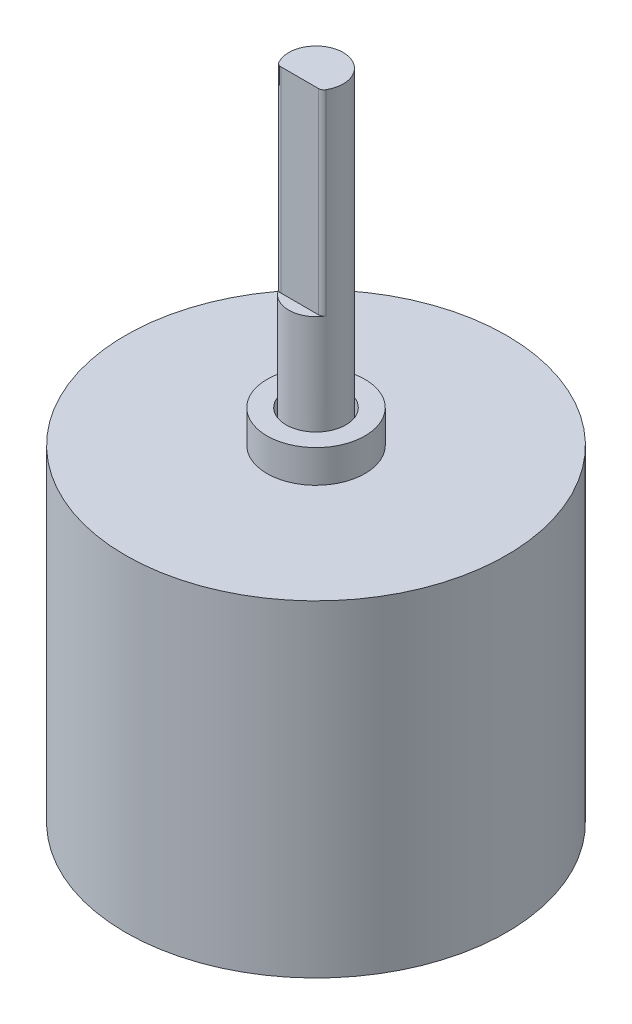
ISO-10303-21;
HEADER;
FILE_DESCRIPTION(('STEP AP214'),'2;1');
FILE_NAME('part.step','',(''),(''),'','','');
FILE_SCHEMA(('AUTOMOTIVE_DESIGN { 1 0 10303 214 1 1 1 1 }'));
ENDSEC;
DATA;
#1=APPLICATION_CONTEXT('core data for automotive mechanical design processes');
#2=APPLICATION_PROTOCOL_DEFINITION('international standard','automotive_design',2000,#1);
#3=PRODUCT_CONTEXT('',#1,'mechanical');
#4=PRODUCT('Part','Part','',(#3));
#5=PRODUCT_RELATED_PRODUCT_CATEGORY('part','',(#4));
#6=PRODUCT_DEFINITION_FORMATION('','',#4);
#7=PRODUCT_DEFINITION_CONTEXT('part definition',#1,'design');
#8=PRODUCT_DEFINITION('design','',#6,#7);
#9=PRODUCT_DEFINITION_SHAPE('','',#8);
#10=(LENGTH_UNIT() NAMED_UNIT(*) SI_UNIT(.MILLI.,.METRE.));
#11=(NAMED_UNIT(*) PLANE_ANGLE_UNIT() SI_UNIT($,.RADIAN.));
#12=(NAMED_UNIT(*) SI_UNIT($,.STERADIAN.) SOLID_ANGLE_UNIT());
#13=UNCERTAINTY_MEASURE_WITH_UNIT(LENGTH_MEASURE(1.E-05),#10,'distance_accuracy_value','');
#14=(GEOMETRIC_REPRESENTATION_CONTEXT(3) GLOBAL_UNCERTAINTY_ASSIGNED_CONTEXT((#13)) GLOBAL_UNIT_ASSIGNED_CONTEXT((#10,
#11,#12)) REPRESENTATION_CONTEXT('',''));
#15=CARTESIAN_POINT('',(0.,0.,0.));
#16=DIRECTION('',(0.,0.,1.));
#17=DIRECTION('',(1.,0.,0.));
#18=AXIS2_PLACEMENT_3D('',#15,#16,#17);
#19=CARTESIAN_POINT('',(-2.,60.,1.5));
#20=DIRECTION('',(0.,0.,-1.));
#21=DIRECTION('',(-1.,0.,0.));
#22=AXIS2_PLACEMENT_3D('',#19,#20,#21);
#23=PLANE('',#22);
#24=DIRECTION('',(1.,0.,0.));
#25=VECTOR('',#24,1.);
#26=CARTESIAN_POINT('',(0.,60.,1.5));
#27=LINE('',#26,#25);
#28=CARTESIAN_POINT('',(-1.73205080756888,60.,1.5));
#29=VERTEX_POINT('',#28);
#30=CARTESIAN_POINT('',(1.73205080756888,60.,1.5));
#31=VERTEX_POINT('',#30);
#32=EDGE_CURVE('E76',#29,#31,#27,.T.);
#33=ORIENTED_EDGE('',*,*,#32,.F.);
#34=DIRECTION('',(0.,1.,0.));
#35=VECTOR('',#34,1.);
#36=CARTESIAN_POINT('',(-1.73205080756888,30.,1.5));
#37=LINE('',#36,#35);
#38=CARTESIAN_POINT('',(-1.73205080756888,42.,1.5));
#39=VERTEX_POINT('',#38);
#40=EDGE_CURVE('E67',#39,#29,#37,.T.);
#41=ORIENTED_EDGE('',*,*,#40,.F.);
#42=DIRECTION('',(1.,0.,0.));
#43=VECTOR('',#42,1.);
#44=CARTESIAN_POINT('',(0.,42.,1.5));
#45=LINE('',#44,#43);
#46=CARTESIAN_POINT('',(1.73205080756888,42.,1.5));
#47=VERTEX_POINT('',#46);
#48=EDGE_CURVE('E63',#47,#39,#45,.F.);
#49=ORIENTED_EDGE('',*,*,#48,.F.);
#50=DIRECTION('',(0.,-1.,0.));
#51=VECTOR('',#50,1.);
#52=CARTESIAN_POINT('',(1.73205080756888,30.,1.5));
#53=LINE('',#52,#51);
#54=EDGE_CURVE('E66',#31,#47,#53,.T.);
#55=ORIENTED_EDGE('',*,*,#54,.F.);
#56=EDGE_LOOP('',(#33,#41,#49,#55));
#57=FACE_BOUND('',#56,.T.);
#58=ADVANCED_FACE('F17',(#57),#23,.F.);
#59=CARTESIAN_POINT('',(0.,42.,1.80545082285079));
#60=DIRECTION('',(0.,1.,0.));
#61=DIRECTION('',(0.,0.,1.));
#62=AXIS2_PLACEMENT_3D('',#59,#60,#61);
#63=PLANE('',#62);
#64=ORIENTED_EDGE('',*,*,#48,.T.);
#65=CARTESIAN_POINT('',(-1.73205080756888,42.,1.));
#66=DIRECTION('',(0.,1.,0.));
#67=DIRECTION('',(0.,0.,1.));
#68=AXIS2_PLACEMENT_3D('',#65,#66,#67);
#69=CIRCLE('',#68,0.5);
#70=CARTESIAN_POINT('',(-2.1650635094611,42.,1.25));
#71=VERTEX_POINT('',#70);
#72=EDGE_CURVE('E20',#71,#39,#69,.T.);
#73=ORIENTED_EDGE('',*,*,#72,.F.);
#74=CARTESIAN_POINT('',(0.,42.,0.));
#75=DIRECTION('',(0.,1.,0.));
#76=DIRECTION('',(0.,0.,1.));
#77=AXIS2_PLACEMENT_3D('',#74,#75,#76);
#78=CIRCLE('',#77,2.5);
#79=CARTESIAN_POINT('',(2.1650635094611,42.,1.25));
#80=VERTEX_POINT('',#79);
#81=EDGE_CURVE('E57',#80,#71,#78,.F.);
#82=ORIENTED_EDGE('',*,*,#81,.F.);
#83=CARTESIAN_POINT('',(1.73205080756888,42.,1.));
#84=DIRECTION('',(0.,-1.,0.));
#85=DIRECTION('',(0.,0.,-1.));
#86=AXIS2_PLACEMENT_3D('',#83,#84,#85);
#87=CIRCLE('',#86,0.5);
#88=EDGE_CURVE('E69',#47,#80,#87,.F.);
#89=ORIENTED_EDGE('',*,*,#88,.F.);
#90=EDGE_LOOP('',(#64,#73,#82,#89));
#91=FACE_BOUND('',#90,.T.);
#92=ADVANCED_FACE('F70',(#91),#63,.T.);
#93=CARTESIAN_POINT('',(-1.73205080756888,30.,1.));
#94=DIRECTION('',(0.,1.,0.));
#95=DIRECTION('',(0.,0.,1.));
#96=AXIS2_PLACEMENT_3D('',#93,#94,#95);
#97=CYLINDRICAL_SURFACE('',#96,0.5);
#98=ORIENTED_EDGE('',*,*,#72,.T.);
#99=ORIENTED_EDGE('',*,*,#40,.T.);
#100=CARTESIAN_POINT('',(-1.73205080756888,60.,1.));
#101=DIRECTION('',(0.,1.,0.));
#102=DIRECTION('',(0.,0.,1.));
#103=AXIS2_PLACEMENT_3D('',#100,#101,#102);
#104=CIRCLE('',#103,0.5);
#105=CARTESIAN_POINT('',(-2.1650635094611,60.,1.25));
#106=VERTEX_POINT('',#105);
#107=EDGE_CURVE('E80',#106,#29,#104,.T.);
#108=ORIENTED_EDGE('',*,*,#107,.F.);
#109=DIRECTION('',(0.,1.,0.));
#110=VECTOR('',#109,1.);
#111=CARTESIAN_POINT('',(-2.1650635094611,30.,1.25));
#112=LINE('',#111,#110);
#113=EDGE_CURVE('E121',#71,#106,#112,.T.);
#114=ORIENTED_EDGE('',*,*,#113,.F.);
#115=EDGE_LOOP('',(#98,#99,#108,#114));
#116=FACE_BOUND('',#115,.T.);
#117=ADVANCED_FACE('F130',(#116),#97,.T.);
#118=CARTESIAN_POINT('',(0.,60.,0.));
#119=DIRECTION('',(0.,1.,0.));
#120=DIRECTION('',(0.,0.,1.));
#121=AXIS2_PLACEMENT_3D('',#118,#119,#120);
#122=PLANE('',#121);
#123=ORIENTED_EDGE('',*,*,#107,.T.);
#124=ORIENTED_EDGE('',*,*,#32,.T.);
#125=CARTESIAN_POINT('',(1.73205080756888,60.,1.));
#126=DIRECTION('',(0.,-1.,0.));
#127=DIRECTION('',(0.,0.,-1.));
#128=AXIS2_PLACEMENT_3D('',#125,#126,#127);
#129=CIRCLE('',#128,0.5);
#130=CARTESIAN_POINT('',(2.1650635094611,60.,1.25));
#131=VERTEX_POINT('',#130);
#132=EDGE_CURVE('E35',#131,#31,#129,.T.);
#133=ORIENTED_EDGE('',*,*,#132,.F.);
#134=CARTESIAN_POINT('',(0.,60.,0.));
#135=DIRECTION('',(0.,1.,0.));
#136=DIRECTION('',(0.,0.,1.));
#137=AXIS2_PLACEMENT_3D('',#134,#135,#136);
#138=CIRCLE('',#137,2.5);
#139=EDGE_CURVE('E118',#106,#131,#138,.F.);
#140=ORIENTED_EDGE('',*,*,#139,.F.);
#141=EDGE_LOOP('',(#123,#124,#133,#140));
#142=FACE_BOUND('',#141,.T.);
#143=ADVANCED_FACE('F128',(#142),#122,.T.);
#144=CARTESIAN_POINT('',(1.73205080756888,30.,1.));
#145=DIRECTION('',(0.,-1.,0.));
#146=DIRECTION('',(0.,0.,-1.));
#147=AXIS2_PLACEMENT_3D('',#144,#145,#146);
#148=CYLINDRICAL_SURFACE('',#147,0.5);
#149=ORIENTED_EDGE('',*,*,#88,.T.);
#150=DIRECTION('',(0.,1.,0.));
#151=VECTOR('',#150,1.);
#152=CARTESIAN_POINT('',(2.1650635094611,30.,1.25));
#153=LINE('',#152,#151);
#154=EDGE_CURVE('E117',#131,#80,#153,.F.);
#155=ORIENTED_EDGE('',*,*,#154,.F.);
#156=ORIENTED_EDGE('',*,*,#132,.T.);
#157=ORIENTED_EDGE('',*,*,#54,.T.);
#158=EDGE_LOOP('',(#149,#155,#156,#157));
#159=FACE_BOUND('',#158,.T.);
#160=ADVANCED_FACE('F74',(#159),#148,.T.);
#161=CARTESIAN_POINT('',(0.,-2.,0.));
#162=DIRECTION('',(0.,1.,0.));
#163=DIRECTION('',(0.,0.,1.));
#164=AXIS2_PLACEMENT_3D('',#161,#162,#163);
#165=PLANE('',#164);
#166=CARTESIAN_POINT('',(0.,-2.,0.));
#167=DIRECTION('',(0.,-1.,0.));
#168=DIRECTION('',(0.,0.,-1.));
#169=AXIS2_PLACEMENT_3D('',#166,#167,#168);
#170=CIRCLE('',#169,2.5);
#171=CARTESIAN_POINT('',(0.,-2.,-2.5));
#172=VERTEX_POINT('',#171);
#173=EDGE_CURVE('E114',#172,#172,#170,.F.);
#174=ORIENTED_EDGE('',*,*,#173,.F.);
#175=EDGE_LOOP('',(#174));
#176=FACE_BOUND('',#175,.T.);
#177=ADVANCED_FACE('F137',(#176),#165,.F.);
#178=CARTESIAN_POINT('',(0.,30.,0.));
#179=DIRECTION('',(0.,1.,0.));
#180=DIRECTION('',(0.,0.,1.));
#181=AXIS2_PLACEMENT_3D('',#178,#179,#180);
#182=CYLINDRICAL_SURFACE('',#181,2.5);
#183=CARTESIAN_POINT('',(0.,30.,0.));
#184=DIRECTION('',(0.,1.,0.));
#185=DIRECTION('',(0.,0.,1.));
#186=AXIS2_PLACEMENT_3D('',#183,#184,#185);
#187=CIRCLE('',#186,2.5);
#188=CARTESIAN_POINT('',(0.,30.,2.5));
#189=VERTEX_POINT('',#188);
#190=EDGE_CURVE('E111',#189,#189,#187,.F.);
#191=ORIENTED_EDGE('',*,*,#190,.F.);
#192=EDGE_LOOP('',(#191));
#193=FACE_BOUND('',#192,.T.);
#194=ORIENTED_EDGE('',*,*,#139,.T.);
#195=ORIENTED_EDGE('',*,*,#154,.T.);
#196=ORIENTED_EDGE('',*,*,#81,.T.);
#197=ORIENTED_EDGE('',*,*,#113,.T.);
#198=EDGE_LOOP('',(#194,#195,#196,#197));
#199=FACE_BOUND('',#198,.T.);
#200=ADVANCED_FACE('F127',(#193,#199),#182,.T.);
#201=CARTESIAN_POINT('',(0.,0.,0.));
#202=DIRECTION('',(0.,-1.,0.));
#203=DIRECTION('',(0.,0.,-1.));
#204=AXIS2_PLACEMENT_3D('',#201,#202,#203);
#205=CYLINDRICAL_SURFACE('',#204,2.5);
#206=CARTESIAN_POINT('',(0.,0.,0.));
#207=DIRECTION('',(0.,-1.,0.));
#208=DIRECTION('',(0.,0.,-1.));
#209=AXIS2_PLACEMENT_3D('',#206,#207,#208);
#210=CIRCLE('',#209,2.5);
#211=CARTESIAN_POINT('',(0.,0.,-2.5));
#212=VERTEX_POINT('',#211);
#213=EDGE_CURVE('E108',#212,#212,#210,.T.);
#214=ORIENTED_EDGE('',*,*,#213,.T.);
#215=EDGE_LOOP('',(#214));
#216=FACE_BOUND('',#215,.T.);
#217=ORIENTED_EDGE('',*,*,#173,.T.);
#218=EDGE_LOOP('',(#217));
#219=FACE_BOUND('',#218,.T.);
#220=ADVANCED_FACE('F188',(#216,#219),#205,.T.);
#221=CARTESIAN_POINT('',(0.,30.,0.));
#222=DIRECTION('',(0.,1.,0.));
#223=DIRECTION('',(0.,0.,1.));
#224=AXIS2_PLACEMENT_3D('',#221,#222,#223);
#225=PLANE('',#224);
#226=ORIENTED_EDGE('',*,*,#190,.T.);
#227=EDGE_LOOP('',(#226));
#228=FACE_BOUND('',#227,.T.);
#229=CARTESIAN_POINT('',(0.,30.,0.));
#230=DIRECTION('',(0.,1.,0.));
#231=DIRECTION('',(0.,0.,1.));
#232=AXIS2_PLACEMENT_3D('',#229,#230,#231);
#233=CIRCLE('',#232,2.75);
#234=CARTESIAN_POINT('',(0.,30.,2.75));
#235=VERTEX_POINT('',#234);
#236=EDGE_CURVE('E105',#235,#235,#233,.T.);
#237=ORIENTED_EDGE('',*,*,#236,.T.);
#238=EDGE_LOOP('',(#237));
#239=FACE_BOUND('',#238,.T.);
#240=ADVANCED_FACE('F184',(#228,#239),#225,.T.);
#241=CARTESIAN_POINT('',(0.,0.,0.));
#242=DIRECTION('',(0.,1.,0.));
#243=DIRECTION('',(0.,0.,1.));
#244=AXIS2_PLACEMENT_3D('',#241,#242,#243);
#245=PLANE('',#244);
#246=ORIENTED_EDGE('',*,*,#213,.F.);
#247=EDGE_LOOP('',(#246));
#248=FACE_BOUND('',#247,.T.);
#249=CARTESIAN_POINT('',(0.,0.,0.));
#250=DIRECTION('',(0.,-1.,0.));
#251=DIRECTION('',(0.,0.,-1.));
#252=AXIS2_PLACEMENT_3D('',#249,#250,#251);
#253=CIRCLE('',#252,2.75);
#254=CARTESIAN_POINT('',(0.,0.,-2.75));
#255=VERTEX_POINT('',#254);
#256=EDGE_CURVE('E102',#255,#255,#253,.T.);
#257=ORIENTED_EDGE('',*,*,#256,.T.);
#258=EDGE_LOOP('',(#257));
#259=FACE_BOUND('',#258,.T.);
#260=ADVANCED_FACE('F180',(#248,#259),#245,.F.);
#261=CARTESIAN_POINT('',(0.,30.,0.));
#262=DIRECTION('',(0.,1.,0.));
#263=DIRECTION('',(0.,0.,1.));
#264=AXIS2_PLACEMENT_3D('',#261,#262,#263);
#265=CYLINDRICAL_SURFACE('',#264,2.75);
#266=ORIENTED_EDGE('',*,*,#236,.F.);
#267=EDGE_LOOP('',(#266));
#268=FACE_BOUND('',#267,.T.);
#269=CARTESIAN_POINT('',(0.,33.,0.));
#270=DIRECTION('',(0.,1.,0.));
#271=DIRECTION('',(0.,0.,1.));
#272=AXIS2_PLACEMENT_3D('',#269,#270,#271);
#273=CIRCLE('',#272,2.75);
#274=CARTESIAN_POINT('',(0.,33.,2.75));
#275=VERTEX_POINT('',#274);
#276=EDGE_CURVE('E99',#275,#275,#273,.F.);
#277=ORIENTED_EDGE('',*,*,#276,.F.);
#278=EDGE_LOOP('',(#277));
#279=FACE_BOUND('',#278,.T.);
#280=ADVANCED_FACE('F176',(#268,#279),#265,.F.);
#281=CARTESIAN_POINT('',(0.,0.,0.));
#282=DIRECTION('',(0.,-1.,0.));
#283=DIRECTION('',(0.,0.,-1.));
#284=AXIS2_PLACEMENT_3D('',#281,#282,#283);
#285=CYLINDRICAL_SURFACE('',#284,2.75);
#286=ORIENTED_EDGE('',*,*,#256,.F.);
#287=EDGE_LOOP('',(#286));
#288=FACE_BOUND('',#287,.T.);
#289=CARTESIAN_POINT('',(0.,-0.5,0.));
#290=DIRECTION('',(0.,-1.,0.));
#291=DIRECTION('',(0.,0.,-1.));
#292=AXIS2_PLACEMENT_3D('',#289,#290,#291);
#293=CIRCLE('',#292,2.75);
#294=CARTESIAN_POINT('',(0.,-0.5,-2.75));
#295=VERTEX_POINT('',#294);
#296=EDGE_CURVE('E96',#295,#295,#293,.T.);
#297=ORIENTED_EDGE('',*,*,#296,.T.);
#298=EDGE_LOOP('',(#297));
#299=FACE_BOUND('',#298,.T.);
#300=ADVANCED_FACE('F172',(#288,#299),#285,.F.);
#301=CARTESIAN_POINT('',(0.,33.,0.));
#302=DIRECTION('',(0.,1.,0.));
#303=DIRECTION('',(0.,0.,1.));
#304=AXIS2_PLACEMENT_3D('',#301,#302,#303);
#305=PLANE('',#304);
#306=ORIENTED_EDGE('',*,*,#276,.T.);
#307=EDGE_LOOP('',(#306));
#308=FACE_BOUND('',#307,.T.);
#309=CARTESIAN_POINT('',(0.,33.,0.));
#310=DIRECTION('',(0.,1.,0.));
#311=DIRECTION('',(0.,0.,1.));
#312=AXIS2_PLACEMENT_3D('',#309,#310,#311);
#313=CIRCLE('',#312,4.5);
#314=CARTESIAN_POINT('',(0.,33.,4.5));
#315=VERTEX_POINT('',#314);
#316=EDGE_CURVE('E93',#315,#315,#313,.F.);
#317=ORIENTED_EDGE('',*,*,#316,.F.);
#318=EDGE_LOOP('',(#317));
#319=FACE_BOUND('',#318,.T.);
#320=ADVANCED_FACE('F168',(#308,#319),#305,.T.);
#321=CARTESIAN_POINT('',(0.,-0.5,0.));
#322=DIRECTION('',(0.,1.,0.));
#323=DIRECTION('',(0.,0.,1.));
#324=AXIS2_PLACEMENT_3D('',#321,#322,#323);
#325=PLANE('',#324);
#326=ORIENTED_EDGE('',*,*,#296,.F.);
#327=EDGE_LOOP('',(#326));
#328=FACE_BOUND('',#327,.T.);
#329=CARTESIAN_POINT('',(0.,-0.5,0.));
#330=DIRECTION('',(0.,-1.,0.));
#331=DIRECTION('',(0.,0.,-1.));
#332=AXIS2_PLACEMENT_3D('',#329,#330,#331);
#333=CIRCLE('',#332,4.5);
#334=CARTESIAN_POINT('',(0.,-0.5,-4.5));
#335=VERTEX_POINT('',#334);
#336=EDGE_CURVE('E90',#335,#335,#333,.F.);
#337=ORIENTED_EDGE('',*,*,#336,.F.);
#338=EDGE_LOOP('',(#337));
#339=FACE_BOUND('',#338,.T.);
#340=ADVANCED_FACE('F164',(#328,#339),#325,.F.);
#341=CARTESIAN_POINT('',(0.,30.,0.));
#342=DIRECTION('',(0.,1.,0.));
#343=DIRECTION('',(0.,0.,1.));
#344=AXIS2_PLACEMENT_3D('',#341,#342,#343);
#345=CYLINDRICAL_SURFACE('',#344,4.5);
#346=CARTESIAN_POINT('',(0.,30.,0.));
#347=DIRECTION('',(0.,1.,0.));
#348=DIRECTION('',(0.,0.,1.));
#349=AXIS2_PLACEMENT_3D('',#346,#347,#348);
#350=CIRCLE('',#349,4.5);
#351=CARTESIAN_POINT('',(0.,30.,4.5));
#352=VERTEX_POINT('',#351);
#353=EDGE_CURVE('E87',#352,#352,#350,.F.);
#354=ORIENTED_EDGE('',*,*,#353,.F.);
#355=EDGE_LOOP('',(#354));
#356=FACE_BOUND('',#355,.T.);
#357=ORIENTED_EDGE('',*,*,#316,.T.);
#358=EDGE_LOOP('',(#357));
#359=FACE_BOUND('',#358,.T.);
#360=ADVANCED_FACE('F160',(#356,#359),#345,.T.);
#361=CARTESIAN_POINT('',(0.,0.,0.));
#362=DIRECTION('',(0.,-1.,0.));
#363=DIRECTION('',(0.,0.,-1.));
#364=AXIS2_PLACEMENT_3D('',#361,#362,#363);
#365=CYLINDRICAL_SURFACE('',#364,4.5);
#366=CARTESIAN_POINT('',(0.,0.,0.));
#367=DIRECTION('',(0.,-1.,0.));
#368=DIRECTION('',(0.,0.,-1.));
#369=AXIS2_PLACEMENT_3D('',#366,#367,#368);
#370=CIRCLE('',#369,4.5);
#371=CARTESIAN_POINT('',(0.,0.,-4.5));
#372=VERTEX_POINT('',#371);
#373=EDGE_CURVE('E84',#372,#372,#370,.T.);
#374=ORIENTED_EDGE('',*,*,#373,.T.);
#375=EDGE_LOOP('',(#374));
#376=FACE_BOUND('',#375,.T.);
#377=ORIENTED_EDGE('',*,*,#336,.T.);
#378=EDGE_LOOP('',(#377));
#379=FACE_BOUND('',#378,.T.);
#380=ADVANCED_FACE('F156',(#376,#379),#365,.T.);
#381=CARTESIAN_POINT('',(0.,30.,0.));
#382=DIRECTION('',(0.,1.,0.));
#383=DIRECTION('',(0.,0.,1.));
#384=AXIS2_PLACEMENT_3D('',#381,#382,#383);
#385=PLANE('',#384);
#386=ORIENTED_EDGE('',*,*,#353,.T.);
#387=EDGE_LOOP('',(#386));
#388=FACE_BOUND('',#387,.T.);
#389=CARTESIAN_POINT('',(0.,30.,0.));
#390=DIRECTION('',(0.,1.,0.));
#391=DIRECTION('',(0.,0.,1.));
#392=AXIS2_PLACEMENT_3D('',#389,#390,#391);
#393=CIRCLE('',#392,17.5);
#394=CARTESIAN_POINT('',(0.,30.,17.5));
#395=VERTEX_POINT('',#394);
#396=EDGE_CURVE('E26',#395,#395,#393,.F.);
#397=ORIENTED_EDGE('',*,*,#396,.F.);
#398=EDGE_LOOP('',(#397));
#399=FACE_BOUND('',#398,.T.);
#400=ADVANCED_FACE('F149',(#388,#399),#385,.T.);
#401=CARTESIAN_POINT('',(0.,0.,0.));
#402=DIRECTION('',(0.,1.,0.));
#403=DIRECTION('',(0.,0.,1.));
#404=AXIS2_PLACEMENT_3D('',#401,#402,#403);
#405=PLANE('',#404);
#406=ORIENTED_EDGE('',*,*,#373,.F.);
#407=EDGE_LOOP('',(#406));
#408=FACE_BOUND('',#407,.T.);
#409=CARTESIAN_POINT('',(0.,0.,0.));
#410=DIRECTION('',(0.,1.,0.));
#411=DIRECTION('',(0.,0.,1.));
#412=AXIS2_PLACEMENT_3D('',#409,#410,#411);
#413=CIRCLE('',#412,17.5);
#414=CARTESIAN_POINT('',(0.,0.,17.5));
#415=VERTEX_POINT('',#414);
#416=EDGE_CURVE('E11',#415,#415,#413,.T.);
#417=ORIENTED_EDGE('',*,*,#416,.F.);
#418=EDGE_LOOP('',(#417));
#419=FACE_BOUND('',#418,.T.);
#420=ADVANCED_FACE('F143',(#408,#419),#405,.F.);
#421=CARTESIAN_POINT('',(0.,0.,0.));
#422=DIRECTION('',(0.,1.,0.));
#423=DIRECTION('',(0.,0.,1.));
#424=AXIS2_PLACEMENT_3D('',#421,#422,#423);
#425=CYLINDRICAL_SURFACE('',#424,17.5);
#426=ORIENTED_EDGE('',*,*,#416,.T.);
#427=EDGE_LOOP('',(#426));
#428=FACE_BOUND('',#427,.T.);
#429=ORIENTED_EDGE('',*,*,#396,.T.);
#430=EDGE_LOOP('',(#429));
#431=FACE_BOUND('',#430,.T.);
#432=ADVANCED_FACE('F141',(#428,#431),#425,.T.);
#433=CLOSED_SHELL('',(#58,#92,#117,#143,#160,#177,#200,#220,#240,#260,#280,#300,#320,#340,#360,
#380,#400,#420,#432));
#434=MANIFOLD_SOLID_BREP('B1',#433);
#435=ADVANCED_BREP_SHAPE_REPRESENTATION('',(#18,#434),#14);
#436=SHAPE_DEFINITION_REPRESENTATION(#9,#435);
ENDSEC;
END-ISO-10303-21;
